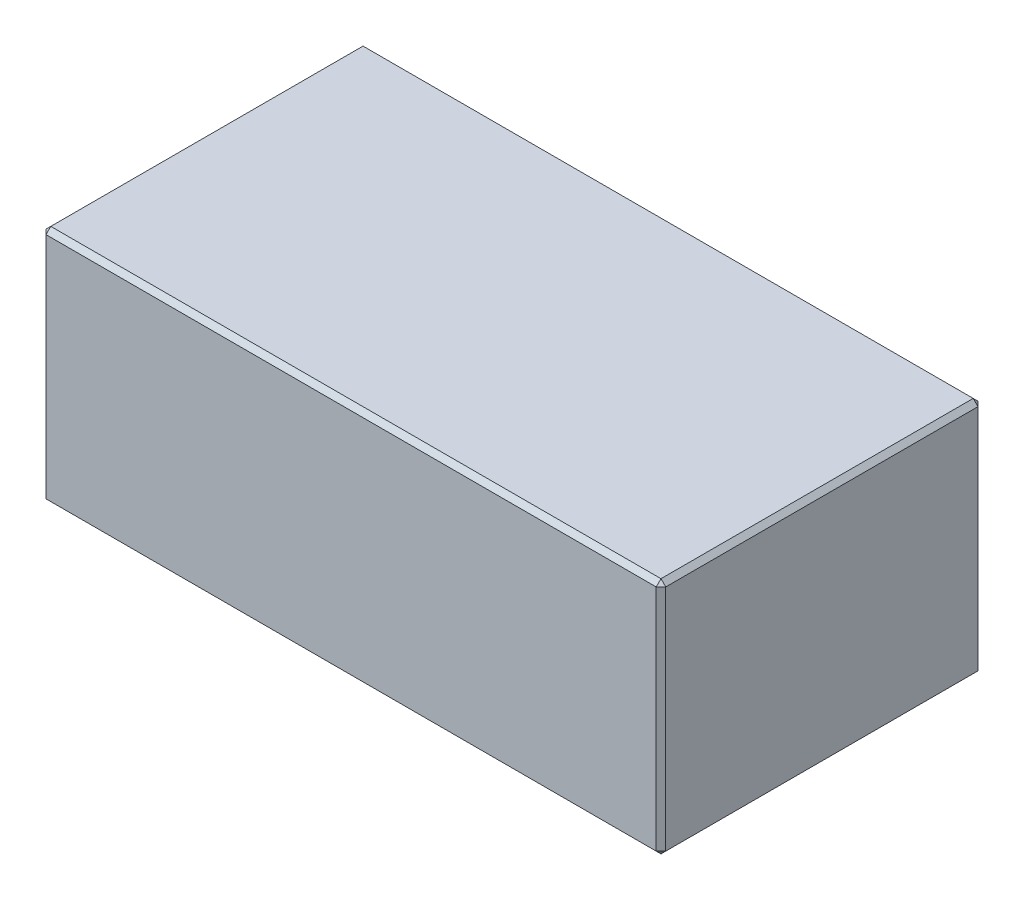
ISO-10303-21;
HEADER;
FILE_DESCRIPTION(('STEP AP214'),'2;1');
FILE_NAME('part.step','',(''),(''),'','','');
FILE_SCHEMA(('AUTOMOTIVE_DESIGN { 1 0 10303 214 1 1 1 1 }'));
ENDSEC;
DATA;
#1=APPLICATION_CONTEXT('core data for automotive mechanical design processes');
#2=APPLICATION_PROTOCOL_DEFINITION('international standard','automotive_design',2000,#1);
#3=PRODUCT_CONTEXT('',#1,'mechanical');
#4=PRODUCT('Part','Part','',(#3));
#5=PRODUCT_RELATED_PRODUCT_CATEGORY('part','',(#4));
#6=PRODUCT_DEFINITION_FORMATION('','',#4);
#7=PRODUCT_DEFINITION_CONTEXT('part definition',#1,'design');
#8=PRODUCT_DEFINITION('design','',#6,#7);
#9=PRODUCT_DEFINITION_SHAPE('','',#8);
#10=(LENGTH_UNIT() NAMED_UNIT(*) SI_UNIT(.MILLI.,.METRE.));
#11=(NAMED_UNIT(*) PLANE_ANGLE_UNIT() SI_UNIT($,.RADIAN.));
#12=(NAMED_UNIT(*) SI_UNIT($,.STERADIAN.) SOLID_ANGLE_UNIT());
#13=UNCERTAINTY_MEASURE_WITH_UNIT(LENGTH_MEASURE(1.E-05),#10,'distance_accuracy_value','');
#14=(GEOMETRIC_REPRESENTATION_CONTEXT(3) GLOBAL_UNCERTAINTY_ASSIGNED_CONTEXT((#13)) GLOBAL_UNIT_ASSIGNED_CONTEXT((#10,
#11,#12)) REPRESENTATION_CONTEXT('',''));
#15=CARTESIAN_POINT('',(0.,0.,0.));
#16=DIRECTION('',(0.,0.,1.));
#17=DIRECTION('',(1.,0.,0.));
#18=AXIS2_PLACEMENT_3D('',#15,#16,#17);
#19=CARTESIAN_POINT('',(-65.,50.,33.75));
#20=DIRECTION('',(1.,0.,0.));
#21=DIRECTION('',(0.,0.,-1.));
#22=AXIS2_PLACEMENT_3D('',#19,#20,#21);
#23=PLANE('',#22);
#24=DIRECTION('',(0.,0.,-1.));
#25=VECTOR('',#24,1.);
#26=CARTESIAN_POINT('',(-65.,49.,-33.75));
#27=LINE('',#26,#25);
#28=CARTESIAN_POINT('',(-65.,49.,32.75));
#29=VERTEX_POINT('',#28);
#30=CARTESIAN_POINT('',(-65.,49.,-32.75));
#31=VERTEX_POINT('',#30);
#32=EDGE_CURVE('E324',#29,#31,#27,.T.);
#33=ORIENTED_EDGE('',*,*,#32,.T.);
#34=DIRECTION('',(0.,-1.,0.));
#35=VECTOR('',#34,1.);
#36=CARTESIAN_POINT('',(-65.,50.,-32.75));
#37=LINE('',#36,#35);
#38=CARTESIAN_POINT('',(-65.,1.00000000000001,-32.75));
#39=VERTEX_POINT('',#38);
#40=EDGE_CURVE('E332',#31,#39,#37,.T.);
#41=ORIENTED_EDGE('',*,*,#40,.T.);
#42=DIRECTION('',(0.,0.,1.));
#43=VECTOR('',#42,1.);
#44=CARTESIAN_POINT('',(-65.,1.00000000000001,33.75));
#45=LINE('',#44,#43);
#46=CARTESIAN_POINT('',(-65.,1.00000000000001,32.75));
#47=VERTEX_POINT('',#46);
#48=EDGE_CURVE('E329',#39,#47,#45,.T.);
#49=ORIENTED_EDGE('',*,*,#48,.T.);
#50=DIRECTION('',(0.,1.,0.));
#51=VECTOR('',#50,1.);
#52=CARTESIAN_POINT('',(-65.,50.,32.75));
#53=LINE('',#52,#51);
#54=EDGE_CURVE('E245',#47,#29,#53,.T.);
#55=ORIENTED_EDGE('',*,*,#54,.T.);
#56=EDGE_LOOP('',(#33,#41,#49,#55));
#57=FACE_BOUND('',#56,.T.);
#58=ADVANCED_FACE('F43',(#57),#23,.F.);
#59=CARTESIAN_POINT('',(65.,50.,33.75));
#60=DIRECTION('',(0.,0.,-1.));
#61=DIRECTION('',(-1.,0.,0.));
#62=AXIS2_PLACEMENT_3D('',#59,#60,#61);
#63=PLANE('',#62);
#64=DIRECTION('',(-1.,0.,0.));
#65=VECTOR('',#64,1.);
#66=CARTESIAN_POINT('',(-65.,49.,33.75));
#67=LINE('',#66,#65);
#68=CARTESIAN_POINT('',(64.,49.,33.75));
#69=VERTEX_POINT('',#68);
#70=CARTESIAN_POINT('',(-64.,49.,33.75));
#71=VERTEX_POINT('',#70);
#72=EDGE_CURVE('E336',#69,#71,#67,.T.);
#73=ORIENTED_EDGE('',*,*,#72,.T.);
#74=DIRECTION('',(0.,-1.,0.));
#75=VECTOR('',#74,1.);
#76=CARTESIAN_POINT('',(-64.,50.,33.75));
#77=LINE('',#76,#75);
#78=CARTESIAN_POINT('',(-64.,1.00000000000001,33.75));
#79=VERTEX_POINT('',#78);
#80=EDGE_CURVE('E248',#71,#79,#77,.T.);
#81=ORIENTED_EDGE('',*,*,#80,.T.);
#82=DIRECTION('',(1.,0.,0.));
#83=VECTOR('',#82,1.);
#84=CARTESIAN_POINT('',(65.,1.00000000000001,33.75));
#85=LINE('',#84,#83);
#86=CARTESIAN_POINT('',(64.,1.00000000000001,33.75));
#87=VERTEX_POINT('',#86);
#88=EDGE_CURVE('E252',#79,#87,#85,.T.);
#89=ORIENTED_EDGE('',*,*,#88,.T.);
#90=DIRECTION('',(0.,1.,0.));
#91=VECTOR('',#90,1.);
#92=CARTESIAN_POINT('',(64.,50.,33.75));
#93=LINE('',#92,#91);
#94=EDGE_CURVE('E257',#87,#69,#93,.T.);
#95=ORIENTED_EDGE('',*,*,#94,.T.);
#96=EDGE_LOOP('',(#73,#81,#89,#95));
#97=FACE_BOUND('',#96,.T.);
#98=ADVANCED_FACE('F341',(#97),#63,.F.);
#99=CARTESIAN_POINT('',(65.,50.,33.75));
#100=DIRECTION('',(-1.,0.,0.));
#101=DIRECTION('',(0.,0.,1.));
#102=AXIS2_PLACEMENT_3D('',#99,#100,#101);
#103=PLANE('',#102);
#104=DIRECTION('',(0.,-1.,0.));
#105=VECTOR('',#104,1.);
#106=CARTESIAN_POINT('',(65.,50.,32.75));
#107=LINE('',#106,#105);
#108=CARTESIAN_POINT('',(65.,49.,32.75));
#109=VERTEX_POINT('',#108);
#110=CARTESIAN_POINT('',(65.,1.00000000000001,32.75));
#111=VERTEX_POINT('',#110);
#112=EDGE_CURVE('E144',#109,#111,#107,.T.);
#113=ORIENTED_EDGE('',*,*,#112,.T.);
#114=DIRECTION('',(0.,0.,-1.));
#115=VECTOR('',#114,1.);
#116=CARTESIAN_POINT('',(65.,1.00000000000001,33.75));
#117=LINE('',#116,#115);
#118=CARTESIAN_POINT('',(65.,1.00000000000001,-32.75));
#119=VERTEX_POINT('',#118);
#120=EDGE_CURVE('E139',#111,#119,#117,.T.);
#121=ORIENTED_EDGE('',*,*,#120,.T.);
#122=DIRECTION('',(0.,1.,0.));
#123=VECTOR('',#122,1.);
#124=CARTESIAN_POINT('',(65.,50.,-32.75));
#125=LINE('',#124,#123);
#126=CARTESIAN_POINT('',(65.,49.,-32.75));
#127=VERTEX_POINT('',#126);
#128=EDGE_CURVE('E133',#119,#127,#125,.T.);
#129=ORIENTED_EDGE('',*,*,#128,.T.);
#130=DIRECTION('',(0.,0.,1.));
#131=VECTOR('',#130,1.);
#132=CARTESIAN_POINT('',(65.,49.,33.75));
#133=LINE('',#132,#131);
#134=EDGE_CURVE('E136',#127,#109,#133,.T.);
#135=ORIENTED_EDGE('',*,*,#134,.T.);
#136=EDGE_LOOP('',(#113,#121,#129,#135));
#137=FACE_BOUND('',#136,.T.);
#138=ADVANCED_FACE('F135',(#137),#103,.F.);
#139=CARTESIAN_POINT('',(65.,50.,-33.75));
#140=DIRECTION('',(0.,0.,1.));
#141=DIRECTION('',(1.,0.,0.));
#142=AXIS2_PLACEMENT_3D('',#139,#140,#141);
#143=PLANE('',#142);
#144=DIRECTION('',(1.,0.,0.));
#145=VECTOR('',#144,1.);
#146=CARTESIAN_POINT('',(65.,49.,-33.75));
#147=LINE('',#146,#145);
#148=CARTESIAN_POINT('',(-64.,49.,-33.75));
#149=VERTEX_POINT('',#148);
#150=CARTESIAN_POINT('',(64.,49.,-33.75));
#151=VERTEX_POINT('',#150);
#152=EDGE_CURVE('E308',#149,#151,#147,.T.);
#153=ORIENTED_EDGE('',*,*,#152,.T.);
#154=DIRECTION('',(0.,-1.,0.));
#155=VECTOR('',#154,1.);
#156=CARTESIAN_POINT('',(64.,50.,-33.75));
#157=LINE('',#156,#155);
#158=CARTESIAN_POINT('',(64.,1.00000000000001,-33.75));
#159=VERTEX_POINT('',#158);
#160=EDGE_CURVE('E168',#151,#159,#157,.T.);
#161=ORIENTED_EDGE('',*,*,#160,.T.);
#162=DIRECTION('',(-1.,0.,0.));
#163=VECTOR('',#162,1.);
#164=CARTESIAN_POINT('',(65.,1.00000000000001,-33.75));
#165=LINE('',#164,#163);
#166=CARTESIAN_POINT('',(-64.,1.00000000000001,-33.75));
#167=VERTEX_POINT('',#166);
#168=EDGE_CURVE('E319',#159,#167,#165,.T.);
#169=ORIENTED_EDGE('',*,*,#168,.T.);
#170=DIRECTION('',(0.,1.,0.));
#171=VECTOR('',#170,1.);
#172=CARTESIAN_POINT('',(-64.,50.,-33.75));
#173=LINE('',#172,#171);
#174=EDGE_CURVE('E312',#167,#149,#173,.T.);
#175=ORIENTED_EDGE('',*,*,#174,.T.);
#176=EDGE_LOOP('',(#153,#161,#169,#175));
#177=FACE_BOUND('',#176,.T.);
#178=ADVANCED_FACE('F386',(#177),#143,.F.);
#179=CARTESIAN_POINT('',(0.,50.,0.));
#180=DIRECTION('',(0.,1.,0.));
#181=DIRECTION('',(0.,0.,1.));
#182=AXIS2_PLACEMENT_3D('',#179,#180,#181);
#183=PLANE('',#182);
#184=DIRECTION('',(0.,0.,-1.));
#185=VECTOR('',#184,1.);
#186=CARTESIAN_POINT('',(64.,50.,-33.75));
#187=LINE('',#186,#185);
#188=CARTESIAN_POINT('',(64.,50.,32.75));
#189=VERTEX_POINT('',#188);
#190=CARTESIAN_POINT('',(64.,50.,-32.75));
#191=VERTEX_POINT('',#190);
#192=EDGE_CURVE('E54',#189,#191,#187,.T.);
#193=ORIENTED_EDGE('',*,*,#192,.T.);
#194=DIRECTION('',(-1.,0.,0.));
#195=VECTOR('',#194,1.);
#196=CARTESIAN_POINT('',(-65.,50.,-32.75));
#197=LINE('',#196,#195);
#198=CARTESIAN_POINT('',(-64.,50.,-32.75));
#199=VERTEX_POINT('',#198);
#200=EDGE_CURVE('E11',#191,#199,#197,.T.);
#201=ORIENTED_EDGE('',*,*,#200,.T.);
#202=DIRECTION('',(0.,0.,1.));
#203=VECTOR('',#202,1.);
#204=CARTESIAN_POINT('',(-64.,50.,33.75));
#205=LINE('',#204,#203);
#206=CARTESIAN_POINT('',(-64.,50.,32.75));
#207=VERTEX_POINT('',#206);
#208=EDGE_CURVE('E251',#199,#207,#205,.T.);
#209=ORIENTED_EDGE('',*,*,#208,.T.);
#210=DIRECTION('',(1.,0.,0.));
#211=VECTOR('',#210,1.);
#212=CARTESIAN_POINT('',(65.,50.,32.75));
#213=LINE('',#212,#211);
#214=EDGE_CURVE('E65',#207,#189,#213,.T.);
#215=ORIENTED_EDGE('',*,*,#214,.T.);
#216=EDGE_LOOP('',(#193,#201,#209,#215));
#217=FACE_BOUND('',#216,.T.);
#218=ADVANCED_FACE('F389',(#217),#183,.T.);
#219=CARTESIAN_POINT('',(0.,0.,0.));
#220=DIRECTION('',(0.,1.,0.));
#221=DIRECTION('',(0.,0.,1.));
#222=AXIS2_PLACEMENT_3D('',#219,#220,#221);
#223=PLANE('',#222);
#224=DIRECTION('',(1.,0.,0.));
#225=VECTOR('',#224,1.);
#226=CARTESIAN_POINT('',(0.,0.,-32.75));
#227=LINE('',#226,#225);
#228=CARTESIAN_POINT('',(-64.,0.,-32.75));
#229=VERTEX_POINT('',#228);
#230=CARTESIAN_POINT('',(64.,0.,-32.75));
#231=VERTEX_POINT('',#230);
#232=EDGE_CURVE('E303',#229,#231,#227,.T.);
#233=ORIENTED_EDGE('',*,*,#232,.T.);
#234=DIRECTION('',(0.,0.,1.));
#235=VECTOR('',#234,1.);
#236=CARTESIAN_POINT('',(64.,0.,0.));
#237=LINE('',#236,#235);
#238=CARTESIAN_POINT('',(64.,0.,32.75));
#239=VERTEX_POINT('',#238);
#240=EDGE_CURVE('E300',#231,#239,#237,.T.);
#241=ORIENTED_EDGE('',*,*,#240,.T.);
#242=DIRECTION('',(-1.,0.,0.));
#243=VECTOR('',#242,1.);
#244=CARTESIAN_POINT('',(0.,0.,32.75));
#245=LINE('',#244,#243);
#246=CARTESIAN_POINT('',(-64.,0.,32.75));
#247=VERTEX_POINT('',#246);
#248=EDGE_CURVE('E290',#239,#247,#245,.T.);
#249=ORIENTED_EDGE('',*,*,#248,.T.);
#250=DIRECTION('',(0.,0.,-1.));
#251=VECTOR('',#250,1.);
#252=CARTESIAN_POINT('',(-64.,0.,0.));
#253=LINE('',#252,#251);
#254=EDGE_CURVE('E297',#247,#229,#253,.T.);
#255=ORIENTED_EDGE('',*,*,#254,.T.);
#256=EDGE_LOOP('',(#233,#241,#249,#255));
#257=FACE_BOUND('',#256,.T.);
#258=ADVANCED_FACE('F301',(#257),#223,.F.);
#259=CARTESIAN_POINT('',(-64.,50.,0.));
#260=DIRECTION('',(-0.707106781186547,0.707106781186547,0.));
#261=DIRECTION('',(0.,0.,-1.));
#262=AXIS2_PLACEMENT_3D('',#259,#260,#261);
#263=PLANE('',#262);
#264=DIRECTION('',(-0.707106781186547,-0.707106781186547,0.));
#265=VECTOR('',#264,1.);
#266=CARTESIAN_POINT('',(-65.,49.,32.75));
#267=LINE('',#266,#265);
#268=EDGE_CURVE('E48',#207,#29,#267,.T.);
#269=ORIENTED_EDGE('',*,*,#268,.F.);
#270=ORIENTED_EDGE('',*,*,#208,.F.);
#271=DIRECTION('',(0.707106781186547,0.707106781186547,0.));
#272=VECTOR('',#271,1.);
#273=CARTESIAN_POINT('',(-64.5,49.5,-32.75));
#274=LINE('',#273,#272);
#275=EDGE_CURVE('E223',#31,#199,#274,.T.);
#276=ORIENTED_EDGE('',*,*,#275,.F.);
#277=ORIENTED_EDGE('',*,*,#32,.F.);
#278=EDGE_LOOP('',(#269,#270,#276,#277));
#279=FACE_BOUND('',#278,.T.);
#280=ADVANCED_FACE('F46',(#279),#263,.T.);
#281=CARTESIAN_POINT('',(-65.,49.,32.75));
#282=DIRECTION('',(-0.577350269189627,0.577350269189631,0.577350269189619));
#283=DIRECTION('',(-0.70710678118655,-0.707106781186545,0.));
#284=AXIS2_PLACEMENT_3D('',#281,#282,#283);
#285=PLANE('',#284);
#286=DIRECTION('',(0.,0.707106781186544,-0.707106781186551));
#287=VECTOR('',#286,1.);
#288=CARTESIAN_POINT('',(-64.,49.5,33.25));
#289=LINE('',#288,#287);
#290=EDGE_CURVE('E216',#207,#71,#289,.F.);
#291=ORIENTED_EDGE('',*,*,#290,.F.);
#292=ORIENTED_EDGE('',*,*,#268,.T.);
#293=DIRECTION('',(-0.707106781186543,0.,-0.707106781186552));
#294=VECTOR('',#293,1.);
#295=CARTESIAN_POINT('',(-65.,49.,32.75));
#296=LINE('',#295,#294);
#297=EDGE_CURVE('E220',#71,#29,#296,.T.);
#298=ORIENTED_EDGE('',*,*,#297,.F.);
#299=EDGE_LOOP('',(#291,#292,#298));
#300=FACE_BOUND('',#299,.T.);
#301=ADVANCED_FACE('F237',(#300),#285,.T.);
#302=CARTESIAN_POINT('',(-64.,49.,-33.75));
#303=DIRECTION('',(-0.577350269189628,0.577350269189628,-0.57735026918962));
#304=DIRECTION('',(-0.707106781186548,-0.707106781186548,0.));
#305=AXIS2_PLACEMENT_3D('',#302,#303,#304);
#306=PLANE('',#305);
#307=DIRECTION('',(0.707106781186543,0.,-0.707106781186552));
#308=VECTOR('',#307,1.);
#309=CARTESIAN_POINT('',(-64.,49.,-33.75));
#310=LINE('',#309,#308);
#311=EDGE_CURVE('E209',#31,#149,#310,.T.);
#312=ORIENTED_EDGE('',*,*,#311,.F.);
#313=ORIENTED_EDGE('',*,*,#275,.T.);
#314=DIRECTION('',(0.,-0.707106781186547,-0.707106781186547));
#315=VECTOR('',#314,1.);
#316=CARTESIAN_POINT('',(-64.,49.,-33.75));
#317=LINE('',#316,#315);
#318=EDGE_CURVE('E213',#149,#199,#317,.F.);
#319=ORIENTED_EDGE('',*,*,#318,.F.);
#320=EDGE_LOOP('',(#312,#313,#319));
#321=FACE_BOUND('',#320,.T.);
#322=ADVANCED_FACE('F415',(#321),#306,.T.);
#323=CARTESIAN_POINT('',(-64.,50.,33.75));
#324=DIRECTION('',(0.707106781186552,0.,-0.707106781186542));
#325=DIRECTION('',(0.,-1.,0.));
#326=AXIS2_PLACEMENT_3D('',#323,#324,#325);
#327=PLANE('',#326);
#328=ORIENTED_EDGE('',*,*,#297,.T.);
#329=ORIENTED_EDGE('',*,*,#54,.F.);
#330=DIRECTION('',(0.707106781186543,0.,0.707106781186552));
#331=VECTOR('',#330,1.);
#332=CARTESIAN_POINT('',(-65.,1.00000000000001,32.75));
#333=LINE('',#332,#331);
#334=EDGE_CURVE('E201',#79,#47,#333,.F.);
#335=ORIENTED_EDGE('',*,*,#334,.F.);
#336=ORIENTED_EDGE('',*,*,#80,.F.);
#337=EDGE_LOOP('',(#328,#329,#335,#336));
#338=FACE_BOUND('',#337,.T.);
#339=ADVANCED_FACE('F243',(#338),#327,.F.);
#340=CARTESIAN_POINT('',(0.,50.,32.75));
#341=DIRECTION('',(0.,0.707106781186551,0.707106781186544));
#342=DIRECTION('',(-1.,0.,0.));
#343=AXIS2_PLACEMENT_3D('',#340,#341,#342);
#344=PLANE('',#343);
#345=ORIENTED_EDGE('',*,*,#290,.T.);
#346=ORIENTED_EDGE('',*,*,#72,.F.);
#347=DIRECTION('',(0.,-0.707106781186544,0.707106781186551));
#348=VECTOR('',#347,1.);
#349=CARTESIAN_POINT('',(64.,49.,33.75));
#350=LINE('',#349,#348);
#351=EDGE_CURVE('E197',#189,#69,#350,.T.);
#352=ORIENTED_EDGE('',*,*,#351,.F.);
#353=ORIENTED_EDGE('',*,*,#214,.F.);
#354=EDGE_LOOP('',(#345,#346,#352,#353));
#355=FACE_BOUND('',#354,.T.);
#356=ADVANCED_FACE('F345',(#355),#344,.T.);
#357=CARTESIAN_POINT('',(64.,50.,0.));
#358=DIRECTION('',(0.707106781186547,0.707106781186547,0.));
#359=DIRECTION('',(0.,0.,1.));
#360=AXIS2_PLACEMENT_3D('',#357,#358,#359);
#361=PLANE('',#360);
#362=DIRECTION('',(0.707106781186548,-0.707106781186548,0.));
#363=VECTOR('',#362,1.);
#364=CARTESIAN_POINT('',(65.,49.,-32.75));
#365=LINE('',#364,#363);
#366=EDGE_CURVE('E150',#191,#127,#365,.T.);
#367=ORIENTED_EDGE('',*,*,#366,.F.);
#368=ORIENTED_EDGE('',*,*,#192,.F.);
#369=DIRECTION('',(-0.707106781186548,0.707106781186548,0.));
#370=VECTOR('',#369,1.);
#371=CARTESIAN_POINT('',(64.5,49.5,32.75));
#372=LINE('',#371,#370);
#373=EDGE_CURVE('E153',#109,#189,#372,.T.);
#374=ORIENTED_EDGE('',*,*,#373,.F.);
#375=ORIENTED_EDGE('',*,*,#134,.F.);
#376=EDGE_LOOP('',(#367,#368,#374,#375));
#377=FACE_BOUND('',#376,.T.);
#378=ADVANCED_FACE('F149',(#377),#361,.T.);
#379=CARTESIAN_POINT('',(0.,50.,-32.75));
#380=DIRECTION('',(0.,0.707106781186547,-0.707106781186547));
#381=DIRECTION('',(1.,0.,0.));
#382=AXIS2_PLACEMENT_3D('',#379,#380,#381);
#383=PLANE('',#382);
#384=ORIENTED_EDGE('',*,*,#318,.T.);
#385=ORIENTED_EDGE('',*,*,#200,.F.);
#386=DIRECTION('',(0.,0.707106781186547,0.707106781186547));
#387=VECTOR('',#386,1.);
#388=CARTESIAN_POINT('',(64.,49.5,-33.25));
#389=LINE('',#388,#387);
#390=EDGE_CURVE('E163',#151,#191,#389,.T.);
#391=ORIENTED_EDGE('',*,*,#390,.F.);
#392=ORIENTED_EDGE('',*,*,#152,.F.);
#393=EDGE_LOOP('',(#384,#385,#391,#392));
#394=FACE_BOUND('',#393,.T.);
#395=ADVANCED_FACE('F440',(#394),#383,.T.);
#396=CARTESIAN_POINT('',(-65.,50.,-32.75));
#397=DIRECTION('',(0.707106781186552,0.,0.707106781186542));
#398=DIRECTION('',(0.,-1.,0.));
#399=AXIS2_PLACEMENT_3D('',#396,#397,#398);
#400=PLANE('',#399);
#401=ORIENTED_EDGE('',*,*,#311,.T.);
#402=ORIENTED_EDGE('',*,*,#174,.F.);
#403=DIRECTION('',(-0.707106781186543,0.,0.707106781186552));
#404=VECTOR('',#403,1.);
#405=CARTESIAN_POINT('',(-64.,1.00000000000001,-33.75));
#406=LINE('',#405,#404);
#407=EDGE_CURVE('E189',#39,#167,#406,.F.);
#408=ORIENTED_EDGE('',*,*,#407,.F.);
#409=ORIENTED_EDGE('',*,*,#40,.F.);
#410=EDGE_LOOP('',(#401,#402,#408,#409));
#411=FACE_BOUND('',#410,.T.);
#412=ADVANCED_FACE('F448',(#411),#400,.F.);
#413=CARTESIAN_POINT('',(-65.,1.00000000000001,33.75));
#414=DIRECTION('',(0.707106781186547,0.707106781186547,0.));
#415=DIRECTION('',(0.,0.,1.));
#416=AXIS2_PLACEMENT_3D('',#413,#414,#415);
#417=PLANE('',#416);
#418=DIRECTION('',(-0.707106781186547,0.707106781186547,0.));
#419=VECTOR('',#418,1.);
#420=CARTESIAN_POINT('',(-65.,1.00000000000001,32.75));
#421=LINE('',#420,#419);
#422=EDGE_CURVE('E205',#47,#247,#421,.F.);
#423=ORIENTED_EDGE('',*,*,#422,.F.);
#424=ORIENTED_EDGE('',*,*,#48,.F.);
#425=DIRECTION('',(0.707106781186547,-0.707106781186547,0.));
#426=VECTOR('',#425,1.);
#427=CARTESIAN_POINT('',(-64.5,0.500000000000014,-32.75));
#428=LINE('',#427,#426);
#429=EDGE_CURVE('E186',#229,#39,#428,.F.);
#430=ORIENTED_EDGE('',*,*,#429,.F.);
#431=ORIENTED_EDGE('',*,*,#254,.F.);
#432=EDGE_LOOP('',(#423,#424,#430,#431));
#433=FACE_BOUND('',#432,.T.);
#434=ADVANCED_FACE('F359',(#433),#417,.F.);
#435=CARTESIAN_POINT('',(-65.,1.00000000000001,32.75));
#436=DIRECTION('',(-0.577350269189627,-0.577350269189631,0.577350269189619));
#437=DIRECTION('',(0.70710678118655,-0.707106781186545,0.));
#438=AXIS2_PLACEMENT_3D('',#435,#436,#437);
#439=PLANE('',#438);
#440=ORIENTED_EDGE('',*,*,#334,.T.);
#441=ORIENTED_EDGE('',*,*,#422,.T.);
#442=DIRECTION('',(0.,-0.707106781186544,-0.707106781186551));
#443=VECTOR('',#442,1.);
#444=CARTESIAN_POINT('',(-64.,0.500000000000013,33.25));
#445=LINE('',#444,#443);
#446=EDGE_CURVE('E176',#79,#247,#445,.T.);
#447=ORIENTED_EDGE('',*,*,#446,.F.);
#448=EDGE_LOOP('',(#440,#441,#447));
#449=FACE_BOUND('',#448,.T.);
#450=ADVANCED_FACE('F462',(#449),#439,.T.);
#451=CARTESIAN_POINT('',(64.,49.,33.75));
#452=DIRECTION('',(0.577350269189625,0.577350269189628,0.577350269189625));
#453=DIRECTION('',(0.,-0.707106781186545,0.70710678118655));
#454=AXIS2_PLACEMENT_3D('',#451,#452,#453);
#455=PLANE('',#454);
#456=ORIENTED_EDGE('',*,*,#373,.T.);
#457=ORIENTED_EDGE('',*,*,#351,.T.);
#458=DIRECTION('',(-0.707106781186547,0.,0.707106781186547));
#459=VECTOR('',#458,1.);
#460=CARTESIAN_POINT('',(64.,49.,33.75));
#461=LINE('',#460,#459);
#462=EDGE_CURVE('E170',#109,#69,#461,.T.);
#463=ORIENTED_EDGE('',*,*,#462,.F.);
#464=EDGE_LOOP('',(#456,#457,#463));
#465=FACE_BOUND('',#464,.T.);
#466=ADVANCED_FACE('F347',(#465),#455,.T.);
#467=CARTESIAN_POINT('',(65.,49.,-32.75));
#468=DIRECTION('',(0.577350269189629,0.577350269189624,-0.577350269189625));
#469=DIRECTION('',(-0.707106781186545,0.,-0.70710678118655));
#470=AXIS2_PLACEMENT_3D('',#467,#468,#469);
#471=PLANE('',#470);
#472=ORIENTED_EDGE('',*,*,#390,.T.);
#473=ORIENTED_EDGE('',*,*,#366,.T.);
#474=DIRECTION('',(0.707106781186545,0.,0.70710678118655));
#475=VECTOR('',#474,1.);
#476=CARTESIAN_POINT('',(65.,49.,-32.75));
#477=LINE('',#476,#475);
#478=EDGE_CURVE('E160',#151,#127,#477,.T.);
#479=ORIENTED_EDGE('',*,*,#478,.F.);
#480=EDGE_LOOP('',(#472,#473,#479));
#481=FACE_BOUND('',#480,.T.);
#482=ADVANCED_FACE('F159',(#481),#471,.T.);
#483=CARTESIAN_POINT('',(-64.,1.00000000000001,-33.75));
#484=DIRECTION('',(-0.577350269189628,-0.577350269189628,-0.57735026918962));
#485=DIRECTION('',(0.707106781186548,-0.707106781186548,0.));
#486=AXIS2_PLACEMENT_3D('',#483,#484,#485);
#487=PLANE('',#486);
#488=ORIENTED_EDGE('',*,*,#429,.T.);
#489=ORIENTED_EDGE('',*,*,#407,.T.);
#490=DIRECTION('',(0.,0.707106781186547,-0.707106781186547));
#491=VECTOR('',#490,1.);
#492=CARTESIAN_POINT('',(-64.,1.00000000000001,-33.75));
#493=LINE('',#492,#491);
#494=EDGE_CURVE('E171',#229,#167,#493,.T.);
#495=ORIENTED_EDGE('',*,*,#494,.F.);
#496=EDGE_LOOP('',(#488,#489,#495));
#497=FACE_BOUND('',#496,.T.);
#498=ADVANCED_FACE('F362',(#497),#487,.T.);
#499=CARTESIAN_POINT('',(65.,1.00000000000001,33.75));
#500=DIRECTION('',(0.,0.707106781186551,-0.707106781186544));
#501=DIRECTION('',(1.,0.,0.));
#502=AXIS2_PLACEMENT_3D('',#499,#500,#501);
#503=PLANE('',#502);
#504=ORIENTED_EDGE('',*,*,#446,.T.);
#505=ORIENTED_EDGE('',*,*,#248,.F.);
#506=DIRECTION('',(0.,0.707106781186544,0.707106781186551));
#507=VECTOR('',#506,1.);
#508=CARTESIAN_POINT('',(64.,0.,32.75));
#509=LINE('',#508,#507);
#510=EDGE_CURVE('E179',#87,#239,#509,.F.);
#511=ORIENTED_EDGE('',*,*,#510,.F.);
#512=ORIENTED_EDGE('',*,*,#88,.F.);
#513=EDGE_LOOP('',(#504,#505,#511,#512));
#514=FACE_BOUND('',#513,.T.);
#515=ADVANCED_FACE('F292',(#514),#503,.F.);
#516=CARTESIAN_POINT('',(65.,50.,32.75));
#517=DIRECTION('',(-0.707106781186547,0.,-0.707106781186547));
#518=DIRECTION('',(0.,-1.,0.));
#519=AXIS2_PLACEMENT_3D('',#516,#517,#518);
#520=PLANE('',#519);
#521=ORIENTED_EDGE('',*,*,#462,.T.);
#522=ORIENTED_EDGE('',*,*,#94,.F.);
#523=DIRECTION('',(0.707106781186548,0.,-0.707106781186548));
#524=VECTOR('',#523,1.);
#525=CARTESIAN_POINT('',(64.5,1.00000000000001,33.25));
#526=LINE('',#525,#524);
#527=EDGE_CURVE('E278',#111,#87,#526,.F.);
#528=ORIENTED_EDGE('',*,*,#527,.F.);
#529=ORIENTED_EDGE('',*,*,#112,.F.);
#530=EDGE_LOOP('',(#521,#522,#528,#529));
#531=FACE_BOUND('',#530,.T.);
#532=ADVANCED_FACE('F349',(#531),#520,.F.);
#533=CARTESIAN_POINT('',(64.,50.,-33.75));
#534=DIRECTION('',(-0.70710678118655,0.,0.707106781186545));
#535=DIRECTION('',(0.,-1.,0.));
#536=AXIS2_PLACEMENT_3D('',#533,#534,#535);
#537=PLANE('',#536);
#538=ORIENTED_EDGE('',*,*,#478,.T.);
#539=ORIENTED_EDGE('',*,*,#128,.F.);
#540=DIRECTION('',(-0.707106781186545,0.,-0.70710678118655));
#541=VECTOR('',#540,1.);
#542=CARTESIAN_POINT('',(65.,1.00000000000001,-32.75));
#543=LINE('',#542,#541);
#544=EDGE_CURVE('E274',#159,#119,#543,.F.);
#545=ORIENTED_EDGE('',*,*,#544,.F.);
#546=ORIENTED_EDGE('',*,*,#160,.F.);
#547=EDGE_LOOP('',(#538,#539,#545,#546));
#548=FACE_BOUND('',#547,.T.);
#549=ADVANCED_FACE('F166',(#548),#537,.F.);
#550=CARTESIAN_POINT('',(65.,1.00000000000001,-33.75));
#551=DIRECTION('',(0.,0.707106781186547,0.707106781186547));
#552=DIRECTION('',(-1.,0.,0.));
#553=AXIS2_PLACEMENT_3D('',#550,#551,#552);
#554=PLANE('',#553);
#555=ORIENTED_EDGE('',*,*,#494,.T.);
#556=ORIENTED_EDGE('',*,*,#168,.F.);
#557=DIRECTION('',(0.,-0.707106781186547,0.707106781186547));
#558=VECTOR('',#557,1.);
#559=CARTESIAN_POINT('',(64.,0.500000000000004,-33.25));
#560=LINE('',#559,#558);
#561=EDGE_CURVE('E271',#231,#159,#560,.F.);
#562=ORIENTED_EDGE('',*,*,#561,.F.);
#563=ORIENTED_EDGE('',*,*,#232,.F.);
#564=EDGE_LOOP('',(#555,#556,#562,#563));
#565=FACE_BOUND('',#564,.T.);
#566=ADVANCED_FACE('F365',(#565),#554,.F.);
#567=CARTESIAN_POINT('',(64.,0.,32.75));
#568=DIRECTION('',(0.577350269189624,-0.577350269189629,0.577350269189625));
#569=DIRECTION('',(0.,-0.707106781186545,-0.70710678118655));
#570=AXIS2_PLACEMENT_3D('',#567,#568,#569);
#571=PLANE('',#570);
#572=ORIENTED_EDGE('',*,*,#527,.T.);
#573=ORIENTED_EDGE('',*,*,#510,.T.);
#574=DIRECTION('',(-0.707106781186548,-0.707106781186548,0.));
#575=VECTOR('',#574,1.);
#576=CARTESIAN_POINT('',(64.,0.,32.75));
#577=LINE('',#576,#575);
#578=EDGE_CURVE('E268',#111,#239,#577,.T.);
#579=ORIENTED_EDGE('',*,*,#578,.F.);
#580=EDGE_LOOP('',(#572,#573,#579));
#581=FACE_BOUND('',#580,.T.);
#582=ADVANCED_FACE('F287',(#581),#571,.T.);
#583=CARTESIAN_POINT('',(65.,1.00000000000001,-32.75));
#584=DIRECTION('',(0.577350269189629,-0.577350269189624,-0.577350269189625));
#585=DIRECTION('',(-0.707106781186545,0.,-0.70710678118655));
#586=AXIS2_PLACEMENT_3D('',#583,#584,#585);
#587=PLANE('',#586);
#588=ORIENTED_EDGE('',*,*,#561,.T.);
#589=ORIENTED_EDGE('',*,*,#544,.T.);
#590=DIRECTION('',(0.707106781186548,0.707106781186548,0.));
#591=VECTOR('',#590,1.);
#592=CARTESIAN_POINT('',(65.,1.00000000000001,-32.75));
#593=LINE('',#592,#591);
#594=EDGE_CURVE('E265',#231,#119,#593,.T.);
#595=ORIENTED_EDGE('',*,*,#594,.F.);
#596=EDGE_LOOP('',(#588,#589,#595));
#597=FACE_BOUND('',#596,.T.);
#598=ADVANCED_FACE('F367',(#597),#587,.T.);
#599=CARTESIAN_POINT('',(65.,1.00000000000001,33.75));
#600=DIRECTION('',(-0.707106781186547,0.707106781186547,0.));
#601=DIRECTION('',(0.,0.,-1.));
#602=AXIS2_PLACEMENT_3D('',#599,#600,#601);
#603=PLANE('',#602);
#604=ORIENTED_EDGE('',*,*,#578,.T.);
#605=ORIENTED_EDGE('',*,*,#240,.F.);
#606=ORIENTED_EDGE('',*,*,#594,.T.);
#607=ORIENTED_EDGE('',*,*,#120,.F.);
#608=EDGE_LOOP('',(#604,#605,#606,#607));
#609=FACE_BOUND('',#608,.T.);
#610=ADVANCED_FACE('F368',(#609),#603,.F.);
#611=CLOSED_SHELL('',(#58,#98,#138,#178,#218,#258,#280,#301,#322,#339,#356,#378,#395,#412,#434,
#450,#466,#482,#498,#515,#532,#549,#566,#582,#598,#610));
#612=MANIFOLD_SOLID_BREP('B2',#611);
#613=ADVANCED_BREP_SHAPE_REPRESENTATION('',(#18,#612),#14);
#614=SHAPE_DEFINITION_REPRESENTATION(#9,#613);
ENDSEC;
END-ISO-10303-21;
